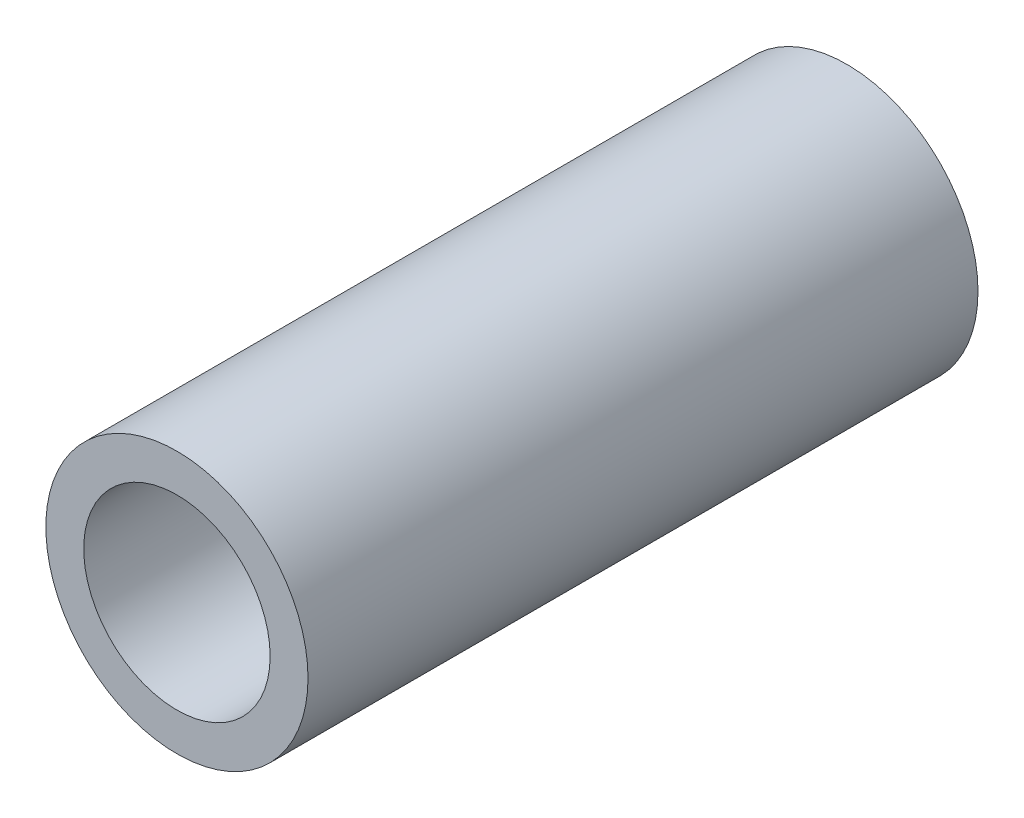
ISO-10303-21;
HEADER;
FILE_DESCRIPTION(('STEP AP214'),'2;1');
FILE_NAME('part.step','',(''),(''),'','','');
FILE_SCHEMA(('AUTOMOTIVE_DESIGN { 1 0 10303 214 1 1 1 1 }'));
ENDSEC;
DATA;
#1=APPLICATION_CONTEXT('core data for automotive mechanical design processes');
#2=APPLICATION_PROTOCOL_DEFINITION('international standard','automotive_design',2000,#1);
#3=PRODUCT_CONTEXT('',#1,'mechanical');
#4=PRODUCT('Part','Part','',(#3));
#5=PRODUCT_RELATED_PRODUCT_CATEGORY('part','',(#4));
#6=PRODUCT_DEFINITION_FORMATION('','',#4);
#7=PRODUCT_DEFINITION_CONTEXT('part definition',#1,'design');
#8=PRODUCT_DEFINITION('design','',#6,#7);
#9=PRODUCT_DEFINITION_SHAPE('','',#8);
#10=(LENGTH_UNIT() NAMED_UNIT(*) SI_UNIT(.MILLI.,.METRE.));
#11=(NAMED_UNIT(*) PLANE_ANGLE_UNIT() SI_UNIT($,.RADIAN.));
#12=(NAMED_UNIT(*) SI_UNIT($,.STERADIAN.) SOLID_ANGLE_UNIT());
#13=UNCERTAINTY_MEASURE_WITH_UNIT(LENGTH_MEASURE(1.E-05),#10,'distance_accuracy_value','');
#14=(GEOMETRIC_REPRESENTATION_CONTEXT(3) GLOBAL_UNCERTAINTY_ASSIGNED_CONTEXT((#13)) GLOBAL_UNIT_ASSIGNED_CONTEXT((#10,
#11,#12)) REPRESENTATION_CONTEXT('',''));
#15=CARTESIAN_POINT('',(0.,0.,0.));
#16=DIRECTION('',(0.,0.,1.));
#17=DIRECTION('',(1.,0.,0.));
#18=AXIS2_PLACEMENT_3D('',#15,#16,#17);
#19=CARTESIAN_POINT('',(12.7916646210623,72.1050671540209,-11.5));
#20=DIRECTION('',(0.,0.,1.));
#21=DIRECTION('',(1.,0.,0.));
#22=AXIS2_PLACEMENT_3D('',#19,#20,#21);
#23=CYLINDRICAL_SURFACE('',#22,2.25);
#24=CARTESIAN_POINT('',(12.7916646210623,72.1050671540209,-11.5));
#25=DIRECTION('',(0.,0.,1.));
#26=DIRECTION('',(1.,0.,0.));
#27=AXIS2_PLACEMENT_3D('',#24,#25,#26);
#28=CIRCLE('',#27,2.25);
#29=CARTESIAN_POINT('',(15.0416646210623,72.1050671540209,-11.5));
#30=VERTEX_POINT('',#29);
#31=EDGE_CURVE('E10',#30,#30,#28,.T.);
#32=ORIENTED_EDGE('',*,*,#31,.T.);
#33=EDGE_LOOP('',(#32));
#34=FACE_BOUND('',#33,.T.);
#35=CARTESIAN_POINT('',(12.7916646210623,72.1050671540209,0.));
#36=DIRECTION('',(0.,0.,1.));
#37=DIRECTION('',(1.,0.,0.));
#38=AXIS2_PLACEMENT_3D('',#35,#36,#37);
#39=CIRCLE('',#38,2.25);
#40=CARTESIAN_POINT('',(15.0416646210623,72.1050671540209,0.));
#41=VERTEX_POINT('',#40);
#42=EDGE_CURVE('E34',#41,#41,#39,.T.);
#43=ORIENTED_EDGE('',*,*,#42,.F.);
#44=EDGE_LOOP('',(#43));
#45=FACE_BOUND('',#44,.T.);
#46=ADVANCED_FACE('F31',(#34,#45),#23,.T.);
#47=CARTESIAN_POINT('',(12.7916646210623,72.1050671540209,-11.5));
#48=DIRECTION('',(0.,0.,1.));
#49=DIRECTION('',(1.,0.,0.));
#50=AXIS2_PLACEMENT_3D('',#47,#48,#49);
#51=PLANE('',#50);
#52=CARTESIAN_POINT('',(12.7916646210623,72.1050671540209,-11.5));
#53=DIRECTION('',(0.,0.,1.));
#54=DIRECTION('',(1.,0.,0.));
#55=AXIS2_PLACEMENT_3D('',#52,#53,#54);
#56=CIRCLE('',#55,1.6);
#57=CARTESIAN_POINT('',(14.3916646210623,72.1050671540209,-11.5));
#58=VERTEX_POINT('',#57);
#59=EDGE_CURVE('E41',#58,#58,#56,.T.);
#60=ORIENTED_EDGE('',*,*,#59,.T.);
#61=EDGE_LOOP('',(#60));
#62=FACE_BOUND('',#61,.T.);
#63=ORIENTED_EDGE('',*,*,#31,.F.);
#64=EDGE_LOOP('',(#63));
#65=FACE_BOUND('',#64,.T.);
#66=ADVANCED_FACE('F49',(#62,#65),#51,.F.);
#67=CARTESIAN_POINT('',(12.7916646210623,72.1050671540209,0.));
#68=DIRECTION('',(0.,0.,1.));
#69=DIRECTION('',(1.,0.,0.));
#70=AXIS2_PLACEMENT_3D('',#67,#68,#69);
#71=PLANE('',#70);
#72=CARTESIAN_POINT('',(12.7916646210623,72.1050671540209,0.));
#73=DIRECTION('',(0.,0.,1.));
#74=DIRECTION('',(1.,0.,0.));
#75=AXIS2_PLACEMENT_3D('',#72,#73,#74);
#76=CIRCLE('',#75,1.6);
#77=CARTESIAN_POINT('',(14.3916646210623,72.1050671540209,0.));
#78=VERTEX_POINT('',#77);
#79=EDGE_CURVE('E43',#78,#78,#76,.T.);
#80=ORIENTED_EDGE('',*,*,#79,.F.);
#81=EDGE_LOOP('',(#80));
#82=FACE_BOUND('',#81,.T.);
#83=ORIENTED_EDGE('',*,*,#42,.T.);
#84=EDGE_LOOP('',(#83));
#85=FACE_BOUND('',#84,.T.);
#86=ADVANCED_FACE('F55',(#82,#85),#71,.T.);
#87=CARTESIAN_POINT('',(12.7916646210623,72.1050671540209,-11.5));
#88=DIRECTION('',(0.,0.,1.));
#89=DIRECTION('',(1.,0.,0.));
#90=AXIS2_PLACEMENT_3D('',#87,#88,#89);
#91=CYLINDRICAL_SURFACE('',#90,1.6);
#92=ORIENTED_EDGE('',*,*,#59,.F.);
#93=EDGE_LOOP('',(#92));
#94=FACE_BOUND('',#93,.T.);
#95=ORIENTED_EDGE('',*,*,#79,.T.);
#96=EDGE_LOOP('',(#95));
#97=FACE_BOUND('',#96,.T.);
#98=ADVANCED_FACE('F52',(#94,#97),#91,.F.);
#99=CLOSED_SHELL('',(#46,#66,#86,#98));
#100=MANIFOLD_SOLID_BREP('B2',#99);
#101=ADVANCED_BREP_SHAPE_REPRESENTATION('',(#18,#100),#14);
#102=SHAPE_DEFINITION_REPRESENTATION(#9,#101);
ENDSEC;
END-ISO-10303-21;
